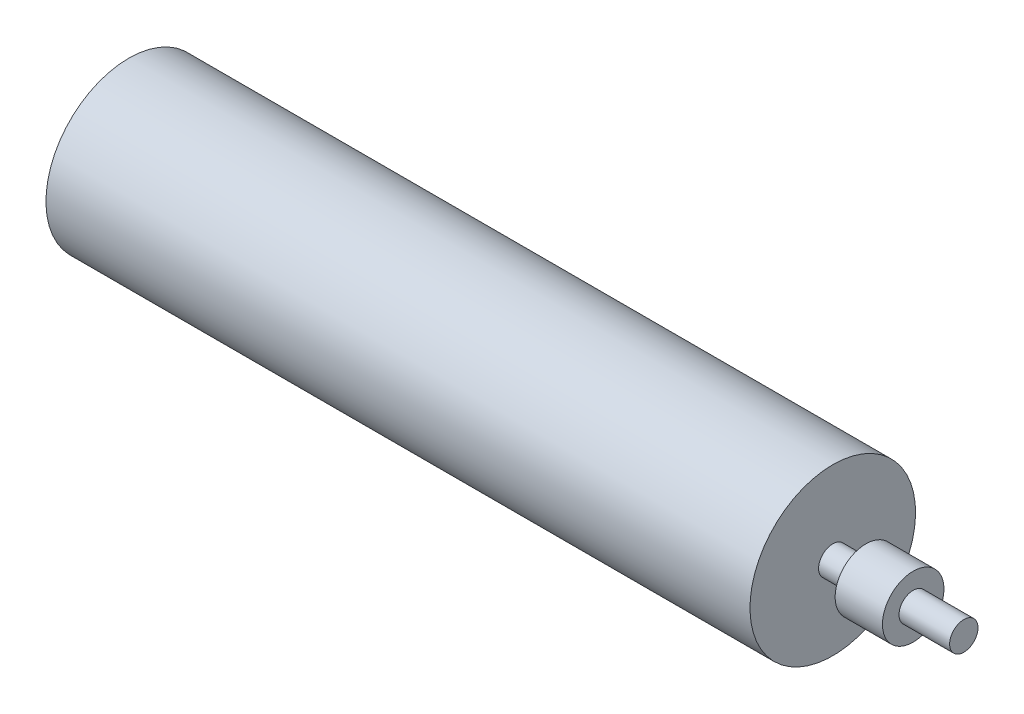
ISO-10303-21;
HEADER;
FILE_DESCRIPTION(('STEP AP214'),'2;1');
FILE_NAME('part.step','',(''),(''),'','','');
FILE_SCHEMA(('AUTOMOTIVE_DESIGN { 1 0 10303 214 1 1 1 1 }'));
ENDSEC;
DATA;
#1=APPLICATION_CONTEXT('core data for automotive mechanical design processes');
#2=APPLICATION_PROTOCOL_DEFINITION('international standard','automotive_design',2000,#1);
#3=PRODUCT_CONTEXT('',#1,'mechanical');
#4=PRODUCT('Part','Part','',(#3));
#5=PRODUCT_RELATED_PRODUCT_CATEGORY('part','',(#4));
#6=PRODUCT_DEFINITION_FORMATION('','',#4);
#7=PRODUCT_DEFINITION_CONTEXT('part definition',#1,'design');
#8=PRODUCT_DEFINITION('design','',#6,#7);
#9=PRODUCT_DEFINITION_SHAPE('','',#8);
#10=(LENGTH_UNIT() NAMED_UNIT(*) SI_UNIT(.MILLI.,.METRE.));
#11=(NAMED_UNIT(*) PLANE_ANGLE_UNIT() SI_UNIT($,.RADIAN.));
#12=(NAMED_UNIT(*) SI_UNIT($,.STERADIAN.) SOLID_ANGLE_UNIT());
#13=UNCERTAINTY_MEASURE_WITH_UNIT(LENGTH_MEASURE(1.E-05),#10,'distance_accuracy_value','');
#14=(GEOMETRIC_REPRESENTATION_CONTEXT(3) GLOBAL_UNCERTAINTY_ASSIGNED_CONTEXT((#13)) GLOBAL_UNIT_ASSIGNED_CONTEXT((#10,
#11,#12)) REPRESENTATION_CONTEXT('',''));
#15=CARTESIAN_POINT('',(0.,0.,0.));
#16=DIRECTION('',(0.,0.,1.));
#17=DIRECTION('',(1.,0.,0.));
#18=AXIS2_PLACEMENT_3D('',#15,#16,#17);
#19=CARTESIAN_POINT('',(-3.73,-13.8300074618737,3.36241386109098));
#20=DIRECTION('',(1.,0.,0.));
#21=DIRECTION('',(0.,1.,0.));
#22=AXIS2_PLACEMENT_3D('',#19,#20,#21);
#23=PLANE('',#22);
#24=CARTESIAN_POINT('',(-3.73,-13.8300074618737,3.36241386109098));
#25=DIRECTION('',(1.,0.,0.));
#26=DIRECTION('',(0.,1.,0.));
#27=AXIS2_PLACEMENT_3D('',#24,#25,#26);
#28=CIRCLE('',#27,0.3);
#29=CARTESIAN_POINT('',(-3.73,-13.5300074618737,3.36241386109098));
#30=VERTEX_POINT('',#29);
#31=EDGE_CURVE('E18',#30,#30,#28,.F.);
#32=ORIENTED_EDGE('',*,*,#31,.F.);
#33=EDGE_LOOP('',(#32));
#34=FACE_BOUND('',#33,.T.);
#35=ADVANCED_FACE('F15',(#34),#23,.T.);
#36=CARTESIAN_POINT('',(-10.0544054705516,-13.8300074618737,3.36241386109098));
#37=DIRECTION('',(1.,0.,0.));
#38=DIRECTION('',(0.,1.,0.));
#39=AXIS2_PLACEMENT_3D('',#36,#37,#38);
#40=CYLINDRICAL_SURFACE('',#39,0.3);
#41=ORIENTED_EDGE('',*,*,#31,.T.);
#42=EDGE_LOOP('',(#41));
#43=FACE_BOUND('',#42,.T.);
#44=CARTESIAN_POINT('',(-4.8,-13.8300074618737,3.36241386109098));
#45=DIRECTION('',(1.,0.,0.));
#46=DIRECTION('',(0.,1.,0.));
#47=AXIS2_PLACEMENT_3D('',#44,#45,#46);
#48=CIRCLE('',#47,0.3);
#49=CARTESIAN_POINT('',(-4.8,-13.5300074618737,3.36241386109098));
#50=VERTEX_POINT('',#49);
#51=EDGE_CURVE('E40',#50,#50,#48,.F.);
#52=ORIENTED_EDGE('',*,*,#51,.F.);
#53=EDGE_LOOP('',(#52));
#54=FACE_BOUND('',#53,.T.);
#55=ADVANCED_FACE('F47',(#43,#54),#40,.T.);
#56=CARTESIAN_POINT('',(-4.8,-13.8300074618737,3.36241386109098));
#57=DIRECTION('',(1.,0.,0.));
#58=DIRECTION('',(0.,1.,0.));
#59=AXIS2_PLACEMENT_3D('',#56,#57,#58);
#60=PLANE('',#59);
#61=CARTESIAN_POINT('',(-4.8,-13.8300074618737,3.36241386109098));
#62=DIRECTION('',(1.,0.,0.));
#63=DIRECTION('',(0.,1.,0.));
#64=AXIS2_PLACEMENT_3D('',#61,#62,#63);
#65=CIRCLE('',#64,0.65);
#66=CARTESIAN_POINT('',(-4.8,-13.1800074618737,3.36241386109098));
#67=VERTEX_POINT('',#66);
#68=EDGE_CURVE('E38',#67,#67,#65,.F.);
#69=ORIENTED_EDGE('',*,*,#68,.F.);
#70=EDGE_LOOP('',(#69));
#71=FACE_BOUND('',#70,.T.);
#72=ORIENTED_EDGE('',*,*,#51,.T.);
#73=EDGE_LOOP('',(#72));
#74=FACE_BOUND('',#73,.T.);
#75=ADVANCED_FACE('F55',(#71,#74),#60,.T.);
#76=CARTESIAN_POINT('',(-5.8,-13.8300074618737,3.36241386109098));
#77=DIRECTION('',(1.,0.,0.));
#78=DIRECTION('',(0.,1.,0.));
#79=AXIS2_PLACEMENT_3D('',#76,#77,#78);
#80=CYLINDRICAL_SURFACE('',#79,0.65);
#81=CARTESIAN_POINT('',(-5.8,-13.8300074618737,3.36241386109098));
#82=DIRECTION('',(1.,0.,0.));
#83=DIRECTION('',(0.,1.,0.));
#84=AXIS2_PLACEMENT_3D('',#81,#82,#83);
#85=CIRCLE('',#84,0.65);
#86=CARTESIAN_POINT('',(-5.8,-13.1800074618737,3.36241386109098));
#87=VERTEX_POINT('',#86);
#88=EDGE_CURVE('E35',#87,#87,#85,.T.);
#89=ORIENTED_EDGE('',*,*,#88,.T.);
#90=EDGE_LOOP('',(#89));
#91=FACE_BOUND('',#90,.T.);
#92=ORIENTED_EDGE('',*,*,#68,.T.);
#93=EDGE_LOOP('',(#92));
#94=FACE_BOUND('',#93,.T.);
#95=ADVANCED_FACE('F78',(#91,#94),#80,.T.);
#96=CARTESIAN_POINT('',(-5.8,-13.8300074618737,3.36241386109098));
#97=DIRECTION('',(1.,0.,0.));
#98=DIRECTION('',(0.,1.,0.));
#99=AXIS2_PLACEMENT_3D('',#96,#97,#98);
#100=PLANE('',#99);
#101=ORIENTED_EDGE('',*,*,#88,.F.);
#102=EDGE_LOOP('',(#101));
#103=FACE_BOUND('',#102,.T.);
#104=CARTESIAN_POINT('',(-5.8,-13.8300074618737,3.36241386109098));
#105=DIRECTION('',(1.,0.,0.));
#106=DIRECTION('',(0.,1.,0.));
#107=AXIS2_PLACEMENT_3D('',#104,#105,#106);
#108=CIRCLE('',#107,0.3);
#109=CARTESIAN_POINT('',(-5.8,-13.5300074618737,3.36241386109098));
#110=VERTEX_POINT('',#109);
#111=EDGE_CURVE('E32',#110,#110,#108,.F.);
#112=ORIENTED_EDGE('',*,*,#111,.F.);
#113=EDGE_LOOP('',(#112));
#114=FACE_BOUND('',#113,.T.);
#115=ADVANCED_FACE('F74',(#103,#114),#100,.F.);
#116=CARTESIAN_POINT('',(-10.0544054705516,-13.8300074618737,3.36241386109098));
#117=DIRECTION('',(1.,0.,0.));
#118=DIRECTION('',(0.,1.,0.));
#119=AXIS2_PLACEMENT_3D('',#116,#117,#118);
#120=CYLINDRICAL_SURFACE('',#119,0.3);
#121=ORIENTED_EDGE('',*,*,#111,.T.);
#122=EDGE_LOOP('',(#121));
#123=FACE_BOUND('',#122,.T.);
#124=CARTESIAN_POINT('',(-6.5,-13.8300074618737,3.36241386109098));
#125=DIRECTION('',(1.,0.,0.));
#126=DIRECTION('',(0.,1.,0.));
#127=AXIS2_PLACEMENT_3D('',#124,#125,#126);
#128=CIRCLE('',#127,0.3);
#129=CARTESIAN_POINT('',(-6.5,-13.5300074618737,3.36241386109098));
#130=VERTEX_POINT('',#129);
#131=EDGE_CURVE('E27',#130,#130,#128,.F.);
#132=ORIENTED_EDGE('',*,*,#131,.F.);
#133=EDGE_LOOP('',(#132));
#134=FACE_BOUND('',#133,.T.);
#135=ADVANCED_FACE('F70',(#123,#134),#120,.T.);
#136=CARTESIAN_POINT('',(-6.5,-13.8300074618737,3.36241386109098));
#137=DIRECTION('',(1.,0.,0.));
#138=DIRECTION('',(0.,1.,0.));
#139=AXIS2_PLACEMENT_3D('',#136,#137,#138);
#140=PLANE('',#139);
#141=CARTESIAN_POINT('',(-6.5,-13.8300074618737,3.36241386109098));
#142=DIRECTION('',(1.,0.,0.));
#143=DIRECTION('',(0.,1.,0.));
#144=AXIS2_PLACEMENT_3D('',#141,#142,#143);
#145=CIRCLE('',#144,1.75);
#146=CARTESIAN_POINT('',(-6.5,-12.0800074618737,3.36241386109098));
#147=VERTEX_POINT('',#146);
#148=EDGE_CURVE('E22',#147,#147,#145,.F.);
#149=ORIENTED_EDGE('',*,*,#148,.F.);
#150=EDGE_LOOP('',(#149));
#151=FACE_BOUND('',#150,.T.);
#152=ORIENTED_EDGE('',*,*,#131,.T.);
#153=EDGE_LOOP('',(#152));
#154=FACE_BOUND('',#153,.T.);
#155=ADVANCED_FACE('F64',(#151,#154),#140,.T.);
#156=CARTESIAN_POINT('',(-21.3814522646422,-13.8300074618737,3.36241386109098));
#157=DIRECTION('',(1.,0.,0.));
#158=DIRECTION('',(0.,1.,0.));
#159=AXIS2_PLACEMENT_3D('',#156,#157,#158);
#160=PLANE('',#159);
#161=CARTESIAN_POINT('',(-21.3814522646422,-13.8300074618737,3.36241386109098));
#162=DIRECTION('',(1.,0.,0.));
#163=DIRECTION('',(0.,1.,0.));
#164=AXIS2_PLACEMENT_3D('',#161,#162,#163);
#165=CIRCLE('',#164,1.75);
#166=CARTESIAN_POINT('',(-21.3814522646422,-12.0800074618737,3.36241386109098));
#167=VERTEX_POINT('',#166);
#168=EDGE_CURVE('E10',#167,#167,#165,.T.);
#169=ORIENTED_EDGE('',*,*,#168,.F.);
#170=EDGE_LOOP('',(#169));
#171=FACE_BOUND('',#170,.T.);
#172=ADVANCED_FACE('F58',(#171),#160,.F.);
#173=CARTESIAN_POINT('',(-21.3814522646422,-13.8300074618737,3.36241386109098));
#174=DIRECTION('',(1.,0.,0.));
#175=DIRECTION('',(0.,1.,0.));
#176=AXIS2_PLACEMENT_3D('',#173,#174,#175);
#177=CYLINDRICAL_SURFACE('',#176,1.75);
#178=ORIENTED_EDGE('',*,*,#148,.T.);
#179=EDGE_LOOP('',(#178));
#180=FACE_BOUND('',#179,.T.);
#181=ORIENTED_EDGE('',*,*,#168,.T.);
#182=EDGE_LOOP('',(#181));
#183=FACE_BOUND('',#182,.T.);
#184=ADVANCED_FACE('F56',(#180,#183),#177,.T.);
#185=CLOSED_SHELL('',(#35,#55,#75,#95,#115,#135,#155,#172,#184));
#186=MANIFOLD_SOLID_BREP('B1',#185);
#187=ADVANCED_BREP_SHAPE_REPRESENTATION('',(#18,#186),#14);
#188=SHAPE_DEFINITION_REPRESENTATION(#9,#187);
ENDSEC;
END-ISO-10303-21;
